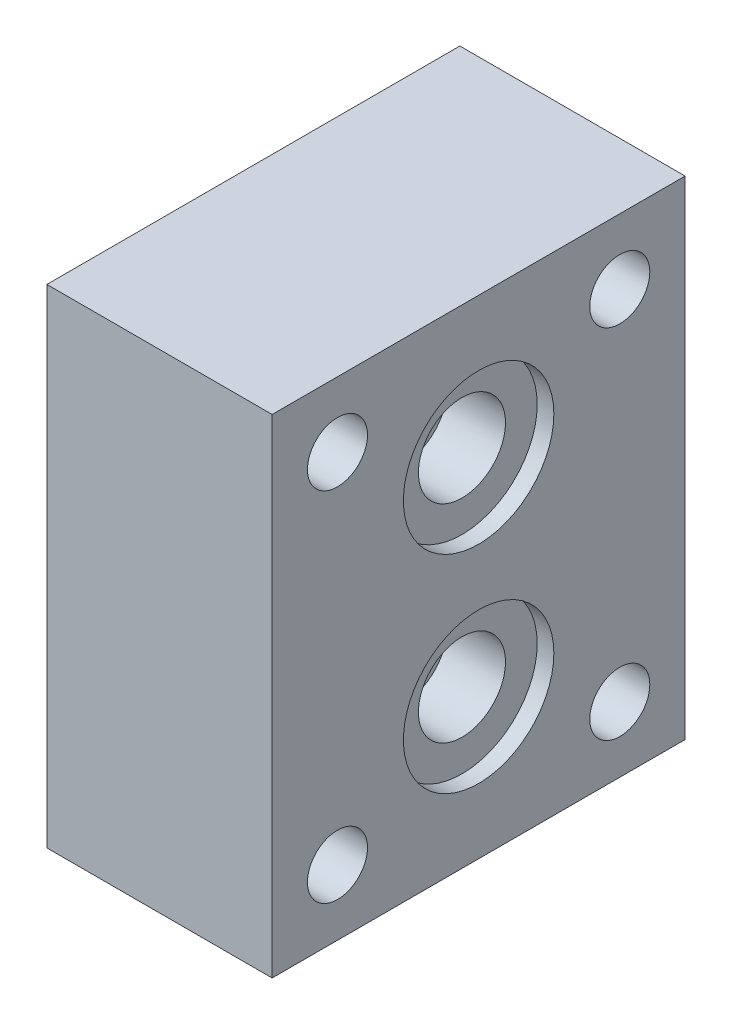
ISO-10303-21;
HEADER;
FILE_DESCRIPTION(('STEP AP214'),'2;1');
FILE_NAME('part.step','',(''),(''),'','','');
FILE_SCHEMA(('AUTOMOTIVE_DESIGN { 1 0 10303 214 1 1 1 1 }'));
ENDSEC;
DATA;
#1=APPLICATION_CONTEXT('core data for automotive mechanical design processes');
#2=APPLICATION_PROTOCOL_DEFINITION('international standard','automotive_design',2000,#1);
#3=PRODUCT_CONTEXT('',#1,'mechanical');
#4=PRODUCT('Part','Part','',(#3));
#5=PRODUCT_RELATED_PRODUCT_CATEGORY('part','',(#4));
#6=PRODUCT_DEFINITION_FORMATION('','',#4);
#7=PRODUCT_DEFINITION_CONTEXT('part definition',#1,'design');
#8=PRODUCT_DEFINITION('design','',#6,#7);
#9=PRODUCT_DEFINITION_SHAPE('','',#8);
#10=(LENGTH_UNIT() NAMED_UNIT(*) SI_UNIT(.MILLI.,.METRE.));
#11=(NAMED_UNIT(*) PLANE_ANGLE_UNIT() SI_UNIT($,.RADIAN.));
#12=(NAMED_UNIT(*) SI_UNIT($,.STERADIAN.) SOLID_ANGLE_UNIT());
#13=UNCERTAINTY_MEASURE_WITH_UNIT(LENGTH_MEASURE(1.E-05),#10,'distance_accuracy_value','');
#14=(GEOMETRIC_REPRESENTATION_CONTEXT(3) GLOBAL_UNCERTAINTY_ASSIGNED_CONTEXT((#13)) GLOBAL_UNIT_ASSIGNED_CONTEXT((#10,
#11,#12)) REPRESENTATION_CONTEXT('',''));
#15=CARTESIAN_POINT('',(0.,0.,0.));
#16=DIRECTION('',(0.,0.,1.));
#17=DIRECTION('',(1.,0.,0.));
#18=AXIS2_PLACEMENT_3D('',#15,#16,#17);
#19=CARTESIAN_POINT('',(38.1,0.,0.));
#20=DIRECTION('',(0.,1.,0.));
#21=DIRECTION('',(0.,0.,1.));
#22=AXIS2_PLACEMENT_3D('',#19,#20,#21);
#23=PLANE('',#22);
#24=DIRECTION('',(0.,0.,-1.));
#25=VECTOR('',#24,1.);
#26=CARTESIAN_POINT('',(0.,0.,0.));
#27=LINE('',#26,#25);
#28=CARTESIAN_POINT('',(0.,0.,69.85));
#29=VERTEX_POINT('',#28);
#30=CARTESIAN_POINT('',(0.,0.,0.));
#31=VERTEX_POINT('',#30);
#32=EDGE_CURVE('E109',#29,#31,#27,.T.);
#33=ORIENTED_EDGE('',*,*,#32,.T.);
#34=DIRECTION('',(-1.,0.,0.));
#35=VECTOR('',#34,1.);
#36=CARTESIAN_POINT('',(38.1,0.,0.));
#37=LINE('',#36,#35);
#38=CARTESIAN_POINT('',(38.1,0.,0.));
#39=VERTEX_POINT('',#38);
#40=EDGE_CURVE('E11',#39,#31,#37,.T.);
#41=ORIENTED_EDGE('',*,*,#40,.F.);
#42=DIRECTION('',(0.,0.,-1.));
#43=VECTOR('',#42,1.);
#44=CARTESIAN_POINT('',(38.1,0.,0.));
#45=LINE('',#44,#43);
#46=CARTESIAN_POINT('',(38.1,0.,69.85));
#47=VERTEX_POINT('',#46);
#48=EDGE_CURVE('E96',#47,#39,#45,.T.);
#49=ORIENTED_EDGE('',*,*,#48,.F.);
#50=DIRECTION('',(-1.,0.,0.));
#51=VECTOR('',#50,1.);
#52=CARTESIAN_POINT('',(38.1,0.,69.85));
#53=LINE('',#52,#51);
#54=EDGE_CURVE('E105',#47,#29,#53,.T.);
#55=ORIENTED_EDGE('',*,*,#54,.T.);
#56=EDGE_LOOP('',(#33,#41,#49,#55));
#57=FACE_BOUND('',#56,.T.);
#58=ADVANCED_FACE('F43',(#57),#23,.F.);
#59=CARTESIAN_POINT('',(38.1,0.,0.));
#60=DIRECTION('',(0.,0.,1.));
#61=DIRECTION('',(1.,0.,0.));
#62=AXIS2_PLACEMENT_3D('',#59,#60,#61);
#63=PLANE('',#62);
#64=DIRECTION('',(0.,1.,0.));
#65=VECTOR('',#64,1.);
#66=CARTESIAN_POINT('',(0.,0.,0.));
#67=LINE('',#66,#65);
#68=CARTESIAN_POINT('',(0.,82.55,0.));
#69=VERTEX_POINT('',#68);
#70=EDGE_CURVE('E100',#31,#69,#67,.T.);
#71=ORIENTED_EDGE('',*,*,#70,.T.);
#72=DIRECTION('',(-1.,0.,0.));
#73=VECTOR('',#72,1.);
#74=CARTESIAN_POINT('',(38.1,82.55,0.));
#75=LINE('',#74,#73);
#76=CARTESIAN_POINT('',(38.1,82.55,0.));
#77=VERTEX_POINT('',#76);
#78=EDGE_CURVE('E52',#77,#69,#75,.T.);
#79=ORIENTED_EDGE('',*,*,#78,.F.);
#80=DIRECTION('',(0.,1.,0.));
#81=VECTOR('',#80,1.);
#82=CARTESIAN_POINT('',(38.1,0.,0.));
#83=LINE('',#82,#81);
#84=EDGE_CURVE('E91',#39,#77,#83,.T.);
#85=ORIENTED_EDGE('',*,*,#84,.F.);
#86=ORIENTED_EDGE('',*,*,#40,.T.);
#87=EDGE_LOOP('',(#71,#79,#85,#86));
#88=FACE_BOUND('',#87,.T.);
#89=ADVANCED_FACE('F99',(#88),#63,.F.);
#90=CARTESIAN_POINT('',(38.1,82.55,0.));
#91=DIRECTION('',(0.,-1.,0.));
#92=DIRECTION('',(0.,0.,-1.));
#93=AXIS2_PLACEMENT_3D('',#90,#91,#92);
#94=PLANE('',#93);
#95=DIRECTION('',(0.,0.,1.));
#96=VECTOR('',#95,1.);
#97=CARTESIAN_POINT('',(0.,82.55,0.));
#98=LINE('',#97,#96);
#99=CARTESIAN_POINT('',(0.,82.55,69.85));
#100=VERTEX_POINT('',#99);
#101=EDGE_CURVE('E78',#69,#100,#98,.T.);
#102=ORIENTED_EDGE('',*,*,#101,.T.);
#103=DIRECTION('',(-1.,0.,0.));
#104=VECTOR('',#103,1.);
#105=CARTESIAN_POINT('',(38.1,82.55,69.85));
#106=LINE('',#105,#104);
#107=CARTESIAN_POINT('',(38.1,82.55,69.85));
#108=VERTEX_POINT('',#107);
#109=EDGE_CURVE('E101',#108,#100,#106,.T.);
#110=ORIENTED_EDGE('',*,*,#109,.F.);
#111=DIRECTION('',(0.,0.,1.));
#112=VECTOR('',#111,1.);
#113=CARTESIAN_POINT('',(38.1,82.55,0.));
#114=LINE('',#113,#112);
#115=EDGE_CURVE('E94',#77,#108,#114,.T.);
#116=ORIENTED_EDGE('',*,*,#115,.F.);
#117=ORIENTED_EDGE('',*,*,#78,.T.);
#118=EDGE_LOOP('',(#102,#110,#116,#117));
#119=FACE_BOUND('',#118,.T.);
#120=ADVANCED_FACE('F103',(#119),#94,.F.);
#121=CARTESIAN_POINT('',(38.1,0.,69.85));
#122=DIRECTION('',(0.,0.,-1.));
#123=DIRECTION('',(-1.,0.,0.));
#124=AXIS2_PLACEMENT_3D('',#121,#122,#123);
#125=PLANE('',#124);
#126=DIRECTION('',(0.,-1.,0.));
#127=VECTOR('',#126,1.);
#128=CARTESIAN_POINT('',(0.,0.,69.85));
#129=LINE('',#128,#127);
#130=EDGE_CURVE('E84',#100,#29,#129,.T.);
#131=ORIENTED_EDGE('',*,*,#130,.T.);
#132=ORIENTED_EDGE('',*,*,#54,.F.);
#133=DIRECTION('',(0.,-1.,0.));
#134=VECTOR('',#133,1.);
#135=CARTESIAN_POINT('',(38.1,0.,69.85));
#136=LINE('',#135,#134);
#137=EDGE_CURVE('E61',#108,#47,#136,.T.);
#138=ORIENTED_EDGE('',*,*,#137,.F.);
#139=ORIENTED_EDGE('',*,*,#109,.T.);
#140=EDGE_LOOP('',(#131,#132,#138,#139));
#141=FACE_BOUND('',#140,.T.);
#142=ADVANCED_FACE('F164',(#141),#125,.F.);
#143=CARTESIAN_POINT('',(38.1,0.,0.));
#144=DIRECTION('',(-1.,0.,0.));
#145=DIRECTION('',(0.,0.,1.));
#146=AXIS2_PLACEMENT_3D('',#143,#144,#145);
#147=PLANE('',#146);
#148=CARTESIAN_POINT('',(38.1,58.801,34.925));
#149=DIRECTION('',(1.,0.,0.));
#150=DIRECTION('',(0.,0.,-1.));
#151=AXIS2_PLACEMENT_3D('',#148,#149,#150);
#152=CIRCLE('',#151,12.7254);
#153=CARTESIAN_POINT('',(38.1,58.801,22.1996));
#154=VERTEX_POINT('',#153);
#155=EDGE_CURVE('E316',#154,#154,#152,.T.);
#156=ORIENTED_EDGE('',*,*,#155,.F.);
#157=EDGE_LOOP('',(#156));
#158=FACE_BOUND('',#157,.T.);
#159=CARTESIAN_POINT('',(38.1,23.749,34.925));
#160=DIRECTION('',(1.,0.,0.));
#161=DIRECTION('',(0.,0.,-1.));
#162=AXIS2_PLACEMENT_3D('',#159,#160,#161);
#163=CIRCLE('',#162,12.7254);
#164=CARTESIAN_POINT('',(38.1,23.749,22.1996));
#165=VERTEX_POINT('',#164);
#166=EDGE_CURVE('E127',#165,#165,#163,.T.);
#167=ORIENTED_EDGE('',*,*,#166,.F.);
#168=EDGE_LOOP('',(#167));
#169=FACE_BOUND('',#168,.T.);
#170=CARTESIAN_POINT('',(38.1,71.501,11.049));
#171=DIRECTION('',(1.,0.,0.));
#172=DIRECTION('',(0.,0.,-1.));
#173=AXIS2_PLACEMENT_3D('',#170,#171,#172);
#174=CIRCLE('',#173,5.08);
#175=CARTESIAN_POINT('',(38.1,71.501,5.96899999999999));
#176=VERTEX_POINT('',#175);
#177=EDGE_CURVE('E141',#176,#176,#174,.T.);
#178=ORIENTED_EDGE('',*,*,#177,.F.);
#179=EDGE_LOOP('',(#178));
#180=FACE_BOUND('',#179,.T.);
#181=CARTESIAN_POINT('',(38.1,11.049,58.801));
#182=DIRECTION('',(1.,0.,0.));
#183=DIRECTION('',(0.,0.,-1.));
#184=AXIS2_PLACEMENT_3D('',#181,#182,#183);
#185=CIRCLE('',#184,5.08);
#186=CARTESIAN_POINT('',(38.1,11.049,53.721));
#187=VERTEX_POINT('',#186);
#188=EDGE_CURVE('E144',#187,#187,#185,.T.);
#189=ORIENTED_EDGE('',*,*,#188,.F.);
#190=EDGE_LOOP('',(#189));
#191=FACE_BOUND('',#190,.T.);
#192=CARTESIAN_POINT('',(38.1,71.501,58.801));
#193=DIRECTION('',(1.,0.,0.));
#194=DIRECTION('',(0.,0.,-1.));
#195=AXIS2_PLACEMENT_3D('',#192,#193,#194);
#196=CIRCLE('',#195,5.08000000000001);
#197=CARTESIAN_POINT('',(38.1,71.501,53.721));
#198=VERTEX_POINT('',#197);
#199=EDGE_CURVE('E150',#198,#198,#196,.T.);
#200=ORIENTED_EDGE('',*,*,#199,.F.);
#201=EDGE_LOOP('',(#200));
#202=FACE_BOUND('',#201,.T.);
#203=CARTESIAN_POINT('',(38.1,11.049,11.049));
#204=DIRECTION('',(1.,0.,0.));
#205=DIRECTION('',(0.,0.,-1.));
#206=AXIS2_PLACEMENT_3D('',#203,#204,#205);
#207=CIRCLE('',#206,5.08);
#208=CARTESIAN_POINT('',(38.1,11.049,5.969));
#209=VERTEX_POINT('',#208);
#210=EDGE_CURVE('E140',#209,#209,#207,.T.);
#211=ORIENTED_EDGE('',*,*,#210,.F.);
#212=EDGE_LOOP('',(#211));
#213=FACE_BOUND('',#212,.T.);
#214=ORIENTED_EDGE('',*,*,#48,.T.);
#215=ORIENTED_EDGE('',*,*,#84,.T.);
#216=ORIENTED_EDGE('',*,*,#115,.T.);
#217=ORIENTED_EDGE('',*,*,#137,.T.);
#218=EDGE_LOOP('',(#214,#215,#216,#217));
#219=FACE_BOUND('',#218,.T.);
#220=ADVANCED_FACE('F92',(#158,#169,#180,#191,#202,#213,#219),#147,.F.);
#221=CARTESIAN_POINT('',(0.,0.,0.));
#222=DIRECTION('',(-1.,0.,0.));
#223=DIRECTION('',(0.,0.,1.));
#224=AXIS2_PLACEMENT_3D('',#221,#222,#223);
#225=PLANE('',#224);
#226=CARTESIAN_POINT('',(0.,71.501,11.049));
#227=DIRECTION('',(1.,0.,0.));
#228=DIRECTION('',(0.,0.,-1.));
#229=AXIS2_PLACEMENT_3D('',#226,#227,#228);
#230=CIRCLE('',#229,5.08);
#231=CARTESIAN_POINT('',(0.,71.501,5.96899999999999));
#232=VERTEX_POINT('',#231);
#233=EDGE_CURVE('E137',#232,#232,#230,.T.);
#234=ORIENTED_EDGE('',*,*,#233,.T.);
#235=EDGE_LOOP('',(#234));
#236=FACE_BOUND('',#235,.T.);
#237=CARTESIAN_POINT('',(0.,11.049,58.801));
#238=DIRECTION('',(1.,0.,0.));
#239=DIRECTION('',(0.,0.,-1.));
#240=AXIS2_PLACEMENT_3D('',#237,#238,#239);
#241=CIRCLE('',#240,5.08);
#242=CARTESIAN_POINT('',(0.,11.049,53.721));
#243=VERTEX_POINT('',#242);
#244=EDGE_CURVE('E147',#243,#243,#241,.T.);
#245=ORIENTED_EDGE('',*,*,#244,.T.);
#246=EDGE_LOOP('',(#245));
#247=FACE_BOUND('',#246,.T.);
#248=CARTESIAN_POINT('',(0.,71.501,58.801));
#249=DIRECTION('',(1.,0.,0.));
#250=DIRECTION('',(0.,0.,-1.));
#251=AXIS2_PLACEMENT_3D('',#248,#249,#250);
#252=CIRCLE('',#251,5.08000000000001);
#253=CARTESIAN_POINT('',(0.,71.501,53.721));
#254=VERTEX_POINT('',#253);
#255=EDGE_CURVE('E124',#254,#254,#252,.T.);
#256=ORIENTED_EDGE('',*,*,#255,.T.);
#257=EDGE_LOOP('',(#256));
#258=FACE_BOUND('',#257,.T.);
#259=CARTESIAN_POINT('',(0.,11.049,11.049));
#260=DIRECTION('',(1.,0.,0.));
#261=DIRECTION('',(0.,0.,-1.));
#262=AXIS2_PLACEMENT_3D('',#259,#260,#261);
#263=CIRCLE('',#262,5.08);
#264=CARTESIAN_POINT('',(0.,11.049,5.969));
#265=VERTEX_POINT('',#264);
#266=EDGE_CURVE('E112',#265,#265,#263,.T.);
#267=ORIENTED_EDGE('',*,*,#266,.T.);
#268=EDGE_LOOP('',(#267));
#269=FACE_BOUND('',#268,.T.);
#270=ORIENTED_EDGE('',*,*,#32,.F.);
#271=ORIENTED_EDGE('',*,*,#130,.F.);
#272=ORIENTED_EDGE('',*,*,#101,.F.);
#273=ORIENTED_EDGE('',*,*,#70,.F.);
#274=EDGE_LOOP('',(#270,#271,#272,#273));
#275=FACE_BOUND('',#274,.T.);
#276=ADVANCED_FACE('F163',(#236,#247,#258,#269,#275),#225,.T.);
#277=CARTESIAN_POINT('',(0.,11.049,11.049));
#278=DIRECTION('',(1.,0.,0.));
#279=DIRECTION('',(0.,0.,-1.));
#280=AXIS2_PLACEMENT_3D('',#277,#278,#279);
#281=CYLINDRICAL_SURFACE('',#280,5.08);
#282=ORIENTED_EDGE('',*,*,#266,.F.);
#283=EDGE_LOOP('',(#282));
#284=FACE_BOUND('',#283,.T.);
#285=ORIENTED_EDGE('',*,*,#210,.T.);
#286=EDGE_LOOP('',(#285));
#287=FACE_BOUND('',#286,.T.);
#288=ADVANCED_FACE('F160',(#284,#287),#281,.F.);
#289=CARTESIAN_POINT('',(0.,71.501,58.801));
#290=DIRECTION('',(1.,0.,0.));
#291=DIRECTION('',(0.,0.,-1.));
#292=AXIS2_PLACEMENT_3D('',#289,#290,#291);
#293=CYLINDRICAL_SURFACE('',#292,5.08000000000001);
#294=ORIENTED_EDGE('',*,*,#255,.F.);
#295=EDGE_LOOP('',(#294));
#296=FACE_BOUND('',#295,.T.);
#297=ORIENTED_EDGE('',*,*,#199,.T.);
#298=EDGE_LOOP('',(#297));
#299=FACE_BOUND('',#298,.T.);
#300=ADVANCED_FACE('F203',(#296,#299),#293,.F.);
#301=CARTESIAN_POINT('',(0.,11.049,58.801));
#302=DIRECTION('',(1.,0.,0.));
#303=DIRECTION('',(0.,0.,-1.));
#304=AXIS2_PLACEMENT_3D('',#301,#302,#303);
#305=CYLINDRICAL_SURFACE('',#304,5.08);
#306=ORIENTED_EDGE('',*,*,#244,.F.);
#307=EDGE_LOOP('',(#306));
#308=FACE_BOUND('',#307,.T.);
#309=ORIENTED_EDGE('',*,*,#188,.T.);
#310=EDGE_LOOP('',(#309));
#311=FACE_BOUND('',#310,.T.);
#312=ADVANCED_FACE('F217',(#308,#311),#305,.F.);
#313=CARTESIAN_POINT('',(0.,71.501,11.049));
#314=DIRECTION('',(1.,0.,0.));
#315=DIRECTION('',(0.,0.,-1.));
#316=AXIS2_PLACEMENT_3D('',#313,#314,#315);
#317=CYLINDRICAL_SURFACE('',#316,5.08);
#318=ORIENTED_EDGE('',*,*,#233,.F.);
#319=EDGE_LOOP('',(#318));
#320=FACE_BOUND('',#319,.T.);
#321=ORIENTED_EDGE('',*,*,#177,.T.);
#322=EDGE_LOOP('',(#321));
#323=FACE_BOUND('',#322,.T.);
#324=ADVANCED_FACE('F226',(#320,#323),#317,.F.);
#325=CARTESIAN_POINT('',(35.2806,23.749,34.925));
#326=DIRECTION('',(1.,0.,0.));
#327=DIRECTION('',(0.,0.,-1.));
#328=AXIS2_PLACEMENT_3D('',#325,#326,#327);
#329=PLANE('',#328);
#330=CARTESIAN_POINT('',(35.2806,23.749,34.925));
#331=DIRECTION('',(1.,0.,0.));
#332=DIRECTION('',(0.,0.,-1.));
#333=AXIS2_PLACEMENT_3D('',#330,#331,#332);
#334=CIRCLE('',#333,12.7254);
#335=CARTESIAN_POINT('',(35.2806,23.749,22.1996));
#336=VERTEX_POINT('',#335);
#337=EDGE_CURVE('E120',#336,#336,#334,.T.);
#338=ORIENTED_EDGE('',*,*,#337,.T.);
#339=EDGE_LOOP('',(#338));
#340=FACE_BOUND('',#339,.T.);
#341=CARTESIAN_POINT('',(35.2806,23.749,34.925));
#342=DIRECTION('',(1.,0.,0.));
#343=DIRECTION('',(0.,0.,-1.));
#344=AXIS2_PLACEMENT_3D('',#341,#342,#343);
#345=CIRCLE('',#344,7.366);
#346=CARTESIAN_POINT('',(35.2806,23.749,27.559));
#347=VERTEX_POINT('',#346);
#348=EDGE_CURVE('E117',#347,#347,#345,.F.);
#349=ORIENTED_EDGE('',*,*,#348,.T.);
#350=EDGE_LOOP('',(#349));
#351=FACE_BOUND('',#350,.T.);
#352=ADVANCED_FACE('F235',(#340,#351),#329,.T.);
#353=CARTESIAN_POINT('',(35.2806,23.749,34.925));
#354=DIRECTION('',(1.,0.,0.));
#355=DIRECTION('',(0.,0.,-1.));
#356=AXIS2_PLACEMENT_3D('',#353,#354,#355);
#357=CYLINDRICAL_SURFACE('',#356,12.7254);
#358=ORIENTED_EDGE('',*,*,#337,.F.);
#359=EDGE_LOOP('',(#358));
#360=FACE_BOUND('',#359,.T.);
#361=ORIENTED_EDGE('',*,*,#166,.T.);
#362=EDGE_LOOP('',(#361));
#363=FACE_BOUND('',#362,.T.);
#364=ADVANCED_FACE('F246',(#360,#363),#357,.F.);
#365=CARTESIAN_POINT('',(25.4,23.749,34.925));
#366=DIRECTION('',(1.,0.,0.));
#367=DIRECTION('',(0.,0.,-1.));
#368=AXIS2_PLACEMENT_3D('',#365,#366,#367);
#369=PLANE('',#368);
#370=CARTESIAN_POINT('',(25.4,23.749,34.925));
#371=DIRECTION('',(1.,0.,0.));
#372=DIRECTION('',(0.,0.,-1.));
#373=AXIS2_PLACEMENT_3D('',#370,#371,#372);
#374=CIRCLE('',#373,7.366);
#375=CARTESIAN_POINT('',(25.4,23.749,27.559));
#376=VERTEX_POINT('',#375);
#377=EDGE_CURVE('E119',#376,#376,#374,.T.);
#378=ORIENTED_EDGE('',*,*,#377,.T.);
#379=EDGE_LOOP('',(#378));
#380=FACE_BOUND('',#379,.T.);
#381=ADVANCED_FACE('F242',(#380),#369,.T.);
#382=CARTESIAN_POINT('',(25.4,23.749,34.925));
#383=DIRECTION('',(1.,0.,0.));
#384=DIRECTION('',(0.,0.,-1.));
#385=AXIS2_PLACEMENT_3D('',#382,#383,#384);
#386=CYLINDRICAL_SURFACE('',#385,7.366);
#387=ORIENTED_EDGE('',*,*,#377,.F.);
#388=EDGE_LOOP('',(#387));
#389=FACE_BOUND('',#388,.T.);
#390=ORIENTED_EDGE('',*,*,#348,.F.);
#391=EDGE_LOOP('',(#390));
#392=FACE_BOUND('',#391,.T.);
#393=ADVANCED_FACE('F245',(#389,#392),#386,.F.);
#394=CARTESIAN_POINT('',(35.2806,58.801,34.925));
#395=DIRECTION('',(1.,0.,0.));
#396=DIRECTION('',(0.,0.,-1.));
#397=AXIS2_PLACEMENT_3D('',#394,#395,#396);
#398=PLANE('',#397);
#399=CARTESIAN_POINT('',(35.2806,58.801,34.925));
#400=DIRECTION('',(1.,0.,0.));
#401=DIRECTION('',(0.,0.,-1.));
#402=AXIS2_PLACEMENT_3D('',#399,#400,#401);
#403=CIRCLE('',#402,12.7254);
#404=CARTESIAN_POINT('',(35.2806,58.801,22.1996));
#405=VERTEX_POINT('',#404);
#406=EDGE_CURVE('E314',#405,#405,#403,.T.);
#407=ORIENTED_EDGE('',*,*,#406,.T.);
#408=EDGE_LOOP('',(#407));
#409=FACE_BOUND('',#408,.T.);
#410=CARTESIAN_POINT('',(35.2806,58.801,34.925));
#411=DIRECTION('',(1.,0.,0.));
#412=DIRECTION('',(0.,0.,-1.));
#413=AXIS2_PLACEMENT_3D('',#410,#411,#412);
#414=CIRCLE('',#413,7.36600000000001);
#415=CARTESIAN_POINT('',(35.2806,58.801,27.559));
#416=VERTEX_POINT('',#415);
#417=EDGE_CURVE('E46',#416,#416,#414,.F.);
#418=ORIENTED_EDGE('',*,*,#417,.T.);
#419=EDGE_LOOP('',(#418));
#420=FACE_BOUND('',#419,.T.);
#421=ADVANCED_FACE('F271',(#409,#420),#398,.T.);
#422=CARTESIAN_POINT('',(35.2806,58.801,34.925));
#423=DIRECTION('',(1.,0.,0.));
#424=DIRECTION('',(0.,0.,-1.));
#425=AXIS2_PLACEMENT_3D('',#422,#423,#424);
#426=CYLINDRICAL_SURFACE('',#425,12.7254);
#427=ORIENTED_EDGE('',*,*,#406,.F.);
#428=EDGE_LOOP('',(#427));
#429=FACE_BOUND('',#428,.T.);
#430=ORIENTED_EDGE('',*,*,#155,.T.);
#431=EDGE_LOOP('',(#430));
#432=FACE_BOUND('',#431,.T.);
#433=ADVANCED_FACE('F278',(#429,#432),#426,.F.);
#434=CARTESIAN_POINT('',(25.4,58.801,34.925));
#435=DIRECTION('',(1.,0.,0.));
#436=DIRECTION('',(0.,0.,-1.));
#437=AXIS2_PLACEMENT_3D('',#434,#435,#436);
#438=PLANE('',#437);
#439=CARTESIAN_POINT('',(25.4,58.801,34.925));
#440=DIRECTION('',(1.,0.,0.));
#441=DIRECTION('',(0.,0.,-1.));
#442=AXIS2_PLACEMENT_3D('',#439,#440,#441);
#443=CIRCLE('',#442,7.36600000000001);
#444=CARTESIAN_POINT('',(25.4,58.801,27.559));
#445=VERTEX_POINT('',#444);
#446=EDGE_CURVE('E132',#445,#445,#443,.T.);
#447=ORIENTED_EDGE('',*,*,#446,.T.);
#448=EDGE_LOOP('',(#447));
#449=FACE_BOUND('',#448,.T.);
#450=ADVANCED_FACE('F275',(#449),#438,.T.);
#451=CARTESIAN_POINT('',(25.4,58.801,34.925));
#452=DIRECTION('',(1.,0.,0.));
#453=DIRECTION('',(0.,0.,-1.));
#454=AXIS2_PLACEMENT_3D('',#451,#452,#453);
#455=CYLINDRICAL_SURFACE('',#454,7.36600000000001);
#456=ORIENTED_EDGE('',*,*,#446,.F.);
#457=EDGE_LOOP('',(#456));
#458=FACE_BOUND('',#457,.T.);
#459=ORIENTED_EDGE('',*,*,#417,.F.);
#460=EDGE_LOOP('',(#459));
#461=FACE_BOUND('',#460,.T.);
#462=ADVANCED_FACE('F277',(#458,#461),#455,.F.);
#463=CLOSED_SHELL('',(#58,#89,#120,#142,#220,#276,#288,#300,#312,#324,#352,#364,#381,#393,#421,
#433,#450,#462));
#464=MANIFOLD_SOLID_BREP('B2',#463);
#465=ADVANCED_BREP_SHAPE_REPRESENTATION('',(#18,#464),#14);
#466=SHAPE_DEFINITION_REPRESENTATION(#9,#465);
ENDSEC;
END-ISO-10303-21;
